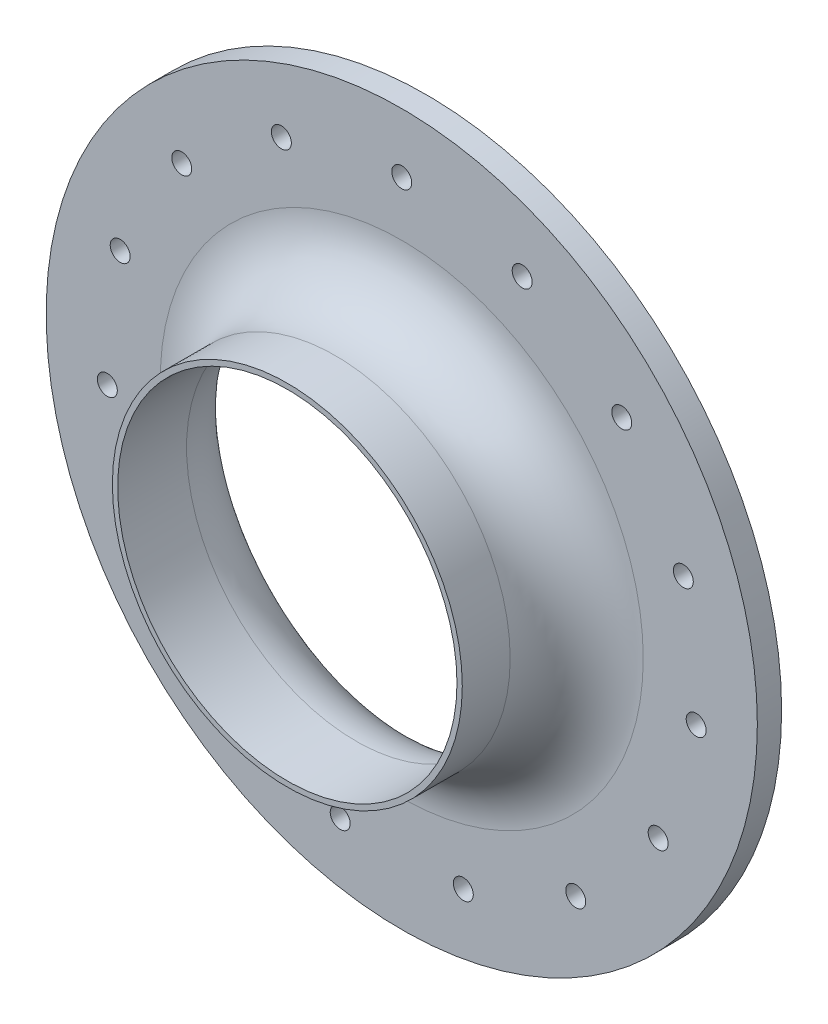
ISO-10303-21;
HEADER;
FILE_DESCRIPTION(('STEP AP214'),'2;1');
FILE_NAME('part.step','',(''),(''),'','','');
FILE_SCHEMA(('AUTOMOTIVE_DESIGN { 1 0 10303 214 1 1 1 1 }'));
ENDSEC;
DATA;
#1=APPLICATION_CONTEXT('core data for automotive mechanical design processes');
#2=APPLICATION_PROTOCOL_DEFINITION('international standard','automotive_design',2000,#1);
#3=PRODUCT_CONTEXT('',#1,'mechanical');
#4=PRODUCT('Part','Part','',(#3));
#5=PRODUCT_RELATED_PRODUCT_CATEGORY('part','',(#4));
#6=PRODUCT_DEFINITION_FORMATION('','',#4);
#7=PRODUCT_DEFINITION_CONTEXT('part definition',#1,'design');
#8=PRODUCT_DEFINITION('design','',#6,#7);
#9=PRODUCT_DEFINITION_SHAPE('','',#8);
#10=(LENGTH_UNIT() NAMED_UNIT(*) SI_UNIT(.MILLI.,.METRE.));
#11=(NAMED_UNIT(*) PLANE_ANGLE_UNIT() SI_UNIT($,.RADIAN.));
#12=(NAMED_UNIT(*) SI_UNIT($,.STERADIAN.) SOLID_ANGLE_UNIT());
#13=UNCERTAINTY_MEASURE_WITH_UNIT(LENGTH_MEASURE(1.E-05),#10,'distance_accuracy_value','');
#14=(GEOMETRIC_REPRESENTATION_CONTEXT(3) GLOBAL_UNCERTAINTY_ASSIGNED_CONTEXT((#13)) GLOBAL_UNIT_ASSIGNED_CONTEXT((#10,
#11,#12)) REPRESENTATION_CONTEXT('',''));
#15=CARTESIAN_POINT('',(0.,0.,0.));
#16=DIRECTION('',(0.,0.,1.));
#17=DIRECTION('',(1.,0.,0.));
#18=AXIS2_PLACEMENT_3D('',#15,#16,#17);
#19=CARTESIAN_POINT('',(0.,0.,0.));
#20=DIRECTION('',(0.,0.,1.));
#21=DIRECTION('',(1.,0.,0.));
#22=AXIS2_PLACEMENT_3D('',#19,#20,#21);
#23=CYLINDRICAL_SURFACE('',#22,53.45);
#24=CARTESIAN_POINT('',(0.,0.,-17.2));
#25=DIRECTION('',(0.,0.,1.));
#26=DIRECTION('',(1.,0.,0.));
#27=AXIS2_PLACEMENT_3D('',#24,#25,#26);
#28=CIRCLE('',#27,53.45);
#29=CARTESIAN_POINT('',(53.45,0.,-17.2));
#30=VERTEX_POINT('',#29);
#31=EDGE_CURVE('E10',#30,#30,#28,.T.);
#32=ORIENTED_EDGE('',*,*,#31,.F.);
#33=EDGE_LOOP('',(#32));
#34=FACE_BOUND('',#33,.T.);
#35=CARTESIAN_POINT('',(0.,0.,-20.85));
#36=DIRECTION('',(0.,0.,1.));
#37=DIRECTION('',(1.,0.,0.));
#38=AXIS2_PLACEMENT_3D('',#35,#36,#37);
#39=CIRCLE('',#38,53.45);
#40=CARTESIAN_POINT('',(53.45,0.,-20.85));
#41=VERTEX_POINT('',#40);
#42=EDGE_CURVE('E67',#41,#41,#39,.T.);
#43=ORIENTED_EDGE('',*,*,#42,.T.);
#44=EDGE_LOOP('',(#43));
#45=FACE_BOUND('',#44,.T.);
#46=ADVANCED_FACE('F39',(#34,#45),#23,.T.);
#47=CARTESIAN_POINT('',(0.,36.3,-17.2));
#48=DIRECTION('',(0.,0.,-1.));
#49=DIRECTION('',(-1.,0.,0.));
#50=AXIS2_PLACEMENT_3D('',#47,#48,#49);
#51=PLANE('',#50);
#52=CARTESIAN_POINT('',(18.0997806168731,40.6527728650957,-17.2));
#53=DIRECTION('',(0.,0.,1.));
#54=DIRECTION('',(1.,0.,0.));
#55=AXIS2_PLACEMENT_3D('',#52,#53,#54);
#56=CIRCLE('',#55,1.5);
#57=CARTESIAN_POINT('',(19.5997806168731,40.6527728650957,-17.2));
#58=VERTEX_POINT('',#57);
#59=EDGE_CURVE('E155',#58,#58,#56,.T.);
#60=ORIENTED_EDGE('',*,*,#59,.F.);
#61=EDGE_LOOP('',(#60));
#62=FACE_BOUND('',#61,.T.);
#63=CARTESIAN_POINT('',(33.0699447337441,29.7763119829692,-17.2));
#64=DIRECTION('',(0.,0.,1.));
#65=DIRECTION('',(1.,0.,0.));
#66=AXIS2_PLACEMENT_3D('',#63,#64,#65);
#67=CIRCLE('',#66,1.5);
#68=CARTESIAN_POINT('',(34.5699447337441,29.7763119829692,-17.2));
#69=VERTEX_POINT('',#68);
#70=EDGE_CURVE('E149',#69,#69,#67,.T.);
#71=ORIENTED_EDGE('',*,*,#70,.F.);
#72=EDGE_LOOP('',(#71));
#73=FACE_BOUND('',#72,.T.);
#74=CARTESIAN_POINT('',(42.3220149751343,13.7512562496852,-17.2));
#75=DIRECTION('',(0.,0.,1.));
#76=DIRECTION('',(1.,0.,0.));
#77=AXIS2_PLACEMENT_3D('',#74,#75,#76);
#78=CIRCLE('',#77,1.5);
#79=CARTESIAN_POINT('',(43.8220149751343,13.7512562496852,-17.2));
#80=VERTEX_POINT('',#79);
#81=EDGE_CURVE('E143',#80,#80,#78,.T.);
#82=ORIENTED_EDGE('',*,*,#81,.F.);
#83=EDGE_LOOP('',(#82));
#84=FACE_BOUND('',#83,.T.);
#85=CARTESIAN_POINT('',(44.2562243438882,-4.65151661541058,-17.2));
#86=DIRECTION('',(0.,0.,1.));
#87=DIRECTION('',(1.,0.,0.));
#88=AXIS2_PLACEMENT_3D('',#85,#86,#87);
#89=CIRCLE('',#88,1.50000000000063);
#90=CARTESIAN_POINT('',(45.7562243438888,-4.65151661541058,-17.2));
#91=VERTEX_POINT('',#90);
#92=EDGE_CURVE('E137',#91,#91,#89,.T.);
#93=ORIENTED_EDGE('',*,*,#92,.F.);
#94=EDGE_LOOP('',(#93));
#95=FACE_BOUND('',#94,.T.);
#96=CARTESIAN_POINT('',(38.5381304684075,-22.25,-17.2));
#97=DIRECTION('',(0.,0.,1.));
#98=DIRECTION('',(1.,0.,0.));
#99=AXIS2_PLACEMENT_3D('',#96,#97,#98);
#100=CIRCLE('',#99,1.5000000000002);
#101=CARTESIAN_POINT('',(40.0381304684077,-22.25,-17.2));
#102=VERTEX_POINT('',#101);
#103=EDGE_CURVE('E131',#102,#102,#100,.T.);
#104=ORIENTED_EDGE('',*,*,#103,.F.);
#105=EDGE_LOOP('',(#104));
#106=FACE_BOUND('',#105,.T.);
#107=CARTESIAN_POINT('',(26.1564437270151,-36.0012562496852,-17.2));
#108=DIRECTION('',(0.,0.,1.));
#109=DIRECTION('',(1.,0.,0.));
#110=AXIS2_PLACEMENT_3D('',#107,#108,#109);
#111=CIRCLE('',#110,1.50000000000021);
#112=CARTESIAN_POINT('',(27.6564437270153,-36.0012562496852,-17.2));
#113=VERTEX_POINT('',#112);
#114=EDGE_CURVE('E125',#113,#113,#111,.T.);
#115=ORIENTED_EDGE('',*,*,#114,.F.);
#116=EDGE_LOOP('',(#115));
#117=FACE_BOUND('',#116,.T.);
#118=CARTESIAN_POINT('',(9.2520702413903,-43.5275682326544,-17.2));
#119=DIRECTION('',(0.,0.,1.));
#120=DIRECTION('',(1.,0.,0.));
#121=AXIS2_PLACEMENT_3D('',#118,#119,#120);
#122=CIRCLE('',#121,1.50000000000026);
#123=CARTESIAN_POINT('',(10.7520702413906,-43.5275682326544,-17.2));
#124=VERTEX_POINT('',#123);
#125=EDGE_CURVE('E119',#124,#124,#122,.T.);
#126=ORIENTED_EDGE('',*,*,#125,.F.);
#127=EDGE_LOOP('',(#126));
#128=FACE_BOUND('',#127,.T.);
#129=CARTESIAN_POINT('',(-9.25207024139029,-43.5275682326544,-17.2));
#130=DIRECTION('',(0.,0.,1.));
#131=DIRECTION('',(1.,0.,0.));
#132=AXIS2_PLACEMENT_3D('',#129,#130,#131);
#133=CIRCLE('',#132,1.50000000000031);
#134=CARTESIAN_POINT('',(-7.75207024138998,-43.5275682326544,-17.2));
#135=VERTEX_POINT('',#134);
#136=EDGE_CURVE('E113',#135,#135,#133,.T.);
#137=ORIENTED_EDGE('',*,*,#136,.F.);
#138=EDGE_LOOP('',(#137));
#139=FACE_BOUND('',#138,.T.);
#140=CARTESIAN_POINT('',(-26.1564437270151,-36.0012562496852,-17.2));
#141=DIRECTION('',(0.,0.,1.));
#142=DIRECTION('',(1.,0.,0.));
#143=AXIS2_PLACEMENT_3D('',#140,#141,#142);
#144=CIRCLE('',#143,1.50000000000034);
#145=CARTESIAN_POINT('',(-24.6564437270147,-36.0012562496852,-17.2));
#146=VERTEX_POINT('',#145);
#147=EDGE_CURVE('E107',#146,#146,#144,.T.);
#148=ORIENTED_EDGE('',*,*,#147,.F.);
#149=EDGE_LOOP('',(#148));
#150=FACE_BOUND('',#149,.T.);
#151=CARTESIAN_POINT('',(-38.5381304684076,-22.25,-17.2));
#152=DIRECTION('',(0.,0.,1.));
#153=DIRECTION('',(1.,0.,0.));
#154=AXIS2_PLACEMENT_3D('',#151,#152,#153);
#155=CIRCLE('',#154,1.50000000000039);
#156=CARTESIAN_POINT('',(-37.0381304684072,-22.25,-17.2));
#157=VERTEX_POINT('',#156);
#158=EDGE_CURVE('E101',#157,#157,#155,.T.);
#159=ORIENTED_EDGE('',*,*,#158,.F.);
#160=EDGE_LOOP('',(#159));
#161=FACE_BOUND('',#160,.T.);
#162=CARTESIAN_POINT('',(-44.2562243438882,-4.65151661541059,-17.2));
#163=DIRECTION('',(0.,0.,1.));
#164=DIRECTION('',(1.,0.,0.));
#165=AXIS2_PLACEMENT_3D('',#162,#163,#164);
#166=CIRCLE('',#165,1.50000000000126);
#167=CARTESIAN_POINT('',(-42.7562243438869,-4.65151661541059,-17.2));
#168=VERTEX_POINT('',#167);
#169=EDGE_CURVE('E95',#168,#168,#166,.T.);
#170=ORIENTED_EDGE('',*,*,#169,.F.);
#171=EDGE_LOOP('',(#170));
#172=FACE_BOUND('',#171,.T.);
#173=CARTESIAN_POINT('',(-42.3220149751344,13.7512562496852,-17.2));
#174=DIRECTION('',(0.,0.,1.));
#175=DIRECTION('',(1.,0.,0.));
#176=AXIS2_PLACEMENT_3D('',#173,#174,#175);
#177=CIRCLE('',#176,1.50000000000103);
#178=CARTESIAN_POINT('',(-40.8220149751333,13.7512562496852,-17.2));
#179=VERTEX_POINT('',#178);
#180=EDGE_CURVE('E89',#179,#179,#177,.T.);
#181=ORIENTED_EDGE('',*,*,#180,.F.);
#182=EDGE_LOOP('',(#181));
#183=FACE_BOUND('',#182,.T.);
#184=CARTESIAN_POINT('',(-33.0699447337441,29.7763119829692,-17.2));
#185=DIRECTION('',(0.,0.,1.));
#186=DIRECTION('',(1.,0.,0.));
#187=AXIS2_PLACEMENT_3D('',#184,#185,#186);
#188=CIRCLE('',#187,1.5);
#189=CARTESIAN_POINT('',(-31.5699447337441,29.7763119829692,-17.2));
#190=VERTEX_POINT('',#189);
#191=EDGE_CURVE('E83',#190,#190,#188,.T.);
#192=ORIENTED_EDGE('',*,*,#191,.F.);
#193=EDGE_LOOP('',(#192));
#194=FACE_BOUND('',#193,.T.);
#195=CARTESIAN_POINT('',(-18.0997806168731,40.6527728650957,-17.2));
#196=DIRECTION('',(0.,0.,1.));
#197=DIRECTION('',(1.,0.,0.));
#198=AXIS2_PLACEMENT_3D('',#195,#196,#197);
#199=CIRCLE('',#198,1.5);
#200=CARTESIAN_POINT('',(-16.5997806168731,40.6527728650957,-17.2));
#201=VERTEX_POINT('',#200);
#202=EDGE_CURVE('E77',#201,#201,#199,.T.);
#203=ORIENTED_EDGE('',*,*,#202,.F.);
#204=EDGE_LOOP('',(#203));
#205=FACE_BOUND('',#204,.T.);
#206=CARTESIAN_POINT('',(0.,44.5,-17.2));
#207=DIRECTION('',(0.,0.,1.));
#208=DIRECTION('',(1.,0.,0.));
#209=AXIS2_PLACEMENT_3D('',#206,#207,#208);
#210=CIRCLE('',#209,1.5);
#211=CARTESIAN_POINT('',(1.5,44.5,-17.2));
#212=VERTEX_POINT('',#211);
#213=EDGE_CURVE('E71',#212,#212,#210,.T.);
#214=ORIENTED_EDGE('',*,*,#213,.F.);
#215=EDGE_LOOP('',(#214));
#216=FACE_BOUND('',#215,.T.);
#217=CARTESIAN_POINT('',(0.,0.,-17.2));
#218=DIRECTION('',(0.,0.,1.));
#219=DIRECTION('',(1.,0.,0.));
#220=AXIS2_PLACEMENT_3D('',#217,#218,#219);
#221=CIRCLE('',#220,36.3);
#222=CARTESIAN_POINT('',(36.3,0.,-17.2));
#223=VERTEX_POINT('',#222);
#224=EDGE_CURVE('E45',#223,#223,#221,.T.);
#225=ORIENTED_EDGE('',*,*,#224,.F.);
#226=EDGE_LOOP('',(#225));
#227=FACE_BOUND('',#226,.T.);
#228=ORIENTED_EDGE('',*,*,#31,.T.);
#229=EDGE_LOOP('',(#228));
#230=FACE_BOUND('',#229,.T.);
#231=ADVANCED_FACE('F171',(#62,#73,#84,#95,#106,#117,#128,#139,#150,#161,#172,#183,#194,#205,
#216,#227,#230),#51,.F.);
#232=CARTESIAN_POINT('',(0.,0.,-7.2));
#233=DIRECTION('',(0.,0.,1.));
#234=DIRECTION('',(1.,0.,0.));
#235=AXIS2_PLACEMENT_3D('',#232,#233,#234);
#236=TOROIDAL_SURFACE('',#235,36.3,9.99999999999999);
#237=CARTESIAN_POINT('',(0.,0.,-7.2));
#238=DIRECTION('',(0.,0.,1.));
#239=DIRECTION('',(1.,0.,0.));
#240=AXIS2_PLACEMENT_3D('',#237,#238,#239);
#241=CIRCLE('',#240,26.3);
#242=CARTESIAN_POINT('',(26.3,0.,-7.2));
#243=VERTEX_POINT('',#242);
#244=EDGE_CURVE('E49',#243,#243,#241,.T.);
#245=ORIENTED_EDGE('',*,*,#244,.F.);
#246=EDGE_LOOP('',(#245));
#247=FACE_BOUND('',#246,.T.);
#248=ORIENTED_EDGE('',*,*,#224,.T.);
#249=EDGE_LOOP('',(#248));
#250=FACE_BOUND('',#249,.T.);
#251=ADVANCED_FACE('F174',(#247,#250),#236,.F.);
#252=CARTESIAN_POINT('',(0.,0.,0.));
#253=DIRECTION('',(0.,0.,1.));
#254=DIRECTION('',(1.,0.,0.));
#255=AXIS2_PLACEMENT_3D('',#252,#253,#254);
#256=CYLINDRICAL_SURFACE('',#255,26.3);
#257=CARTESIAN_POINT('',(0.,0.,0.));
#258=DIRECTION('',(0.,0.,1.));
#259=DIRECTION('',(1.,0.,0.));
#260=AXIS2_PLACEMENT_3D('',#257,#258,#259);
#261=CIRCLE('',#260,26.3);
#262=CARTESIAN_POINT('',(26.3,0.,0.));
#263=VERTEX_POINT('',#262);
#264=EDGE_CURVE('E53',#263,#263,#261,.T.);
#265=ORIENTED_EDGE('',*,*,#264,.F.);
#266=EDGE_LOOP('',(#265));
#267=FACE_BOUND('',#266,.T.);
#268=ORIENTED_EDGE('',*,*,#244,.T.);
#269=EDGE_LOOP('',(#268));
#270=FACE_BOUND('',#269,.T.);
#271=ADVANCED_FACE('F243',(#267,#270),#256,.T.);
#272=CARTESIAN_POINT('',(0.,25.5,0.));
#273=DIRECTION('',(0.,0.,-1.));
#274=DIRECTION('',(-1.,0.,0.));
#275=AXIS2_PLACEMENT_3D('',#272,#273,#274);
#276=PLANE('',#275);
#277=CARTESIAN_POINT('',(0.,0.,0.));
#278=DIRECTION('',(0.,0.,1.));
#279=DIRECTION('',(1.,0.,0.));
#280=AXIS2_PLACEMENT_3D('',#277,#278,#279);
#281=CIRCLE('',#280,25.5);
#282=CARTESIAN_POINT('',(25.5,0.,0.));
#283=VERTEX_POINT('',#282);
#284=EDGE_CURVE('E58',#283,#283,#281,.T.);
#285=ORIENTED_EDGE('',*,*,#284,.F.);
#286=EDGE_LOOP('',(#285));
#287=FACE_BOUND('',#286,.T.);
#288=ORIENTED_EDGE('',*,*,#264,.T.);
#289=EDGE_LOOP('',(#288));
#290=FACE_BOUND('',#289,.T.);
#291=ADVANCED_FACE('F237',(#287,#290),#276,.F.);
#292=CARTESIAN_POINT('',(0.,0.,0.));
#293=DIRECTION('',(0.,0.,1.));
#294=DIRECTION('',(1.,0.,0.));
#295=AXIS2_PLACEMENT_3D('',#292,#293,#294);
#296=CYLINDRICAL_SURFACE('',#295,25.5);
#297=CARTESIAN_POINT('',(0.,0.,-10.35));
#298=DIRECTION('',(0.,0.,1.));
#299=DIRECTION('',(1.,0.,0.));
#300=AXIS2_PLACEMENT_3D('',#297,#298,#299);
#301=CIRCLE('',#300,25.5);
#302=CARTESIAN_POINT('',(25.5,0.,-10.35));
#303=VERTEX_POINT('',#302);
#304=EDGE_CURVE('E61',#303,#303,#301,.T.);
#305=ORIENTED_EDGE('',*,*,#304,.F.);
#306=EDGE_LOOP('',(#305));
#307=FACE_BOUND('',#306,.T.);
#308=ORIENTED_EDGE('',*,*,#284,.T.);
#309=EDGE_LOOP('',(#308));
#310=FACE_BOUND('',#309,.T.);
#311=ADVANCED_FACE('F231',(#307,#310),#296,.F.);
#312=CARTESIAN_POINT('',(0.,0.,-10.35));
#313=DIRECTION('',(0.,0.,1.));
#314=DIRECTION('',(1.,0.,0.));
#315=AXIS2_PLACEMENT_3D('',#312,#313,#314);
#316=TOROIDAL_SURFACE('',#315,36.,10.5);
#317=CARTESIAN_POINT('',(0.,0.,-20.85));
#318=DIRECTION('',(0.,0.,1.));
#319=DIRECTION('',(1.,0.,0.));
#320=AXIS2_PLACEMENT_3D('',#317,#318,#319);
#321=CIRCLE('',#320,36.);
#322=CARTESIAN_POINT('',(36.,0.,-20.85));
#323=VERTEX_POINT('',#322);
#324=EDGE_CURVE('E64',#323,#323,#321,.T.);
#325=ORIENTED_EDGE('',*,*,#324,.F.);
#326=EDGE_LOOP('',(#325));
#327=FACE_BOUND('',#326,.T.);
#328=ORIENTED_EDGE('',*,*,#304,.T.);
#329=EDGE_LOOP('',(#328));
#330=FACE_BOUND('',#329,.T.);
#331=ADVANCED_FACE('F216',(#327,#330),#316,.T.);
#332=CARTESIAN_POINT('',(0.,46.5,-20.85));
#333=DIRECTION('',(0.,0.,1.));
#334=DIRECTION('',(1.,0.,0.));
#335=AXIS2_PLACEMENT_3D('',#332,#333,#334);
#336=PLANE('',#335);
#337=CARTESIAN_POINT('',(18.0997806168731,40.6527728650957,-20.85));
#338=DIRECTION('',(0.,0.,1.));
#339=DIRECTION('',(1.,0.,0.));
#340=AXIS2_PLACEMENT_3D('',#337,#338,#339);
#341=CIRCLE('',#340,1.5);
#342=CARTESIAN_POINT('',(19.5997806168731,40.6527728650957,-20.85));
#343=VERTEX_POINT('',#342);
#344=EDGE_CURVE('E74',#343,#343,#341,.T.);
#345=ORIENTED_EDGE('',*,*,#344,.T.);
#346=EDGE_LOOP('',(#345));
#347=FACE_BOUND('',#346,.T.);
#348=CARTESIAN_POINT('',(33.0699447337441,29.7763119829692,-20.85));
#349=DIRECTION('',(0.,0.,1.));
#350=DIRECTION('',(1.,0.,0.));
#351=AXIS2_PLACEMENT_3D('',#348,#349,#350);
#352=CIRCLE('',#351,1.5);
#353=CARTESIAN_POINT('',(34.5699447337441,29.7763119829692,-20.85));
#354=VERTEX_POINT('',#353);
#355=EDGE_CURVE('E152',#354,#354,#352,.T.);
#356=ORIENTED_EDGE('',*,*,#355,.T.);
#357=EDGE_LOOP('',(#356));
#358=FACE_BOUND('',#357,.T.);
#359=CARTESIAN_POINT('',(42.3220149751343,13.7512562496852,-20.85));
#360=DIRECTION('',(0.,0.,1.));
#361=DIRECTION('',(1.,0.,0.));
#362=AXIS2_PLACEMENT_3D('',#359,#360,#361);
#363=CIRCLE('',#362,1.5);
#364=CARTESIAN_POINT('',(43.8220149751343,13.7512562496852,-20.85));
#365=VERTEX_POINT('',#364);
#366=EDGE_CURVE('E146',#365,#365,#363,.T.);
#367=ORIENTED_EDGE('',*,*,#366,.T.);
#368=EDGE_LOOP('',(#367));
#369=FACE_BOUND('',#368,.T.);
#370=CARTESIAN_POINT('',(44.2562243438882,-4.65151661541058,-20.85));
#371=DIRECTION('',(0.,0.,1.));
#372=DIRECTION('',(1.,0.,0.));
#373=AXIS2_PLACEMENT_3D('',#370,#371,#372);
#374=CIRCLE('',#373,1.50000000000063);
#375=CARTESIAN_POINT('',(45.7562243438888,-4.65151661541058,-20.85));
#376=VERTEX_POINT('',#375);
#377=EDGE_CURVE('E140',#376,#376,#374,.T.);
#378=ORIENTED_EDGE('',*,*,#377,.T.);
#379=EDGE_LOOP('',(#378));
#380=FACE_BOUND('',#379,.T.);
#381=CARTESIAN_POINT('',(38.5381304684075,-22.25,-20.85));
#382=DIRECTION('',(0.,0.,1.));
#383=DIRECTION('',(1.,0.,0.));
#384=AXIS2_PLACEMENT_3D('',#381,#382,#383);
#385=CIRCLE('',#384,1.5000000000002);
#386=CARTESIAN_POINT('',(40.0381304684077,-22.25,-20.85));
#387=VERTEX_POINT('',#386);
#388=EDGE_CURVE('E134',#387,#387,#385,.T.);
#389=ORIENTED_EDGE('',*,*,#388,.T.);
#390=EDGE_LOOP('',(#389));
#391=FACE_BOUND('',#390,.T.);
#392=CARTESIAN_POINT('',(26.1564437270151,-36.0012562496852,-20.85));
#393=DIRECTION('',(0.,0.,1.));
#394=DIRECTION('',(1.,0.,0.));
#395=AXIS2_PLACEMENT_3D('',#392,#393,#394);
#396=CIRCLE('',#395,1.50000000000021);
#397=CARTESIAN_POINT('',(27.6564437270153,-36.0012562496852,-20.85));
#398=VERTEX_POINT('',#397);
#399=EDGE_CURVE('E128',#398,#398,#396,.T.);
#400=ORIENTED_EDGE('',*,*,#399,.T.);
#401=EDGE_LOOP('',(#400));
#402=FACE_BOUND('',#401,.T.);
#403=CARTESIAN_POINT('',(9.2520702413903,-43.5275682326544,-20.85));
#404=DIRECTION('',(0.,0.,1.));
#405=DIRECTION('',(1.,0.,0.));
#406=AXIS2_PLACEMENT_3D('',#403,#404,#405);
#407=CIRCLE('',#406,1.50000000000026);
#408=CARTESIAN_POINT('',(10.7520702413906,-43.5275682326544,-20.85));
#409=VERTEX_POINT('',#408);
#410=EDGE_CURVE('E122',#409,#409,#407,.T.);
#411=ORIENTED_EDGE('',*,*,#410,.T.);
#412=EDGE_LOOP('',(#411));
#413=FACE_BOUND('',#412,.T.);
#414=CARTESIAN_POINT('',(-9.25207024139029,-43.5275682326544,-20.85));
#415=DIRECTION('',(0.,0.,1.));
#416=DIRECTION('',(1.,0.,0.));
#417=AXIS2_PLACEMENT_3D('',#414,#415,#416);
#418=CIRCLE('',#417,1.50000000000031);
#419=CARTESIAN_POINT('',(-7.75207024138998,-43.5275682326544,-20.85));
#420=VERTEX_POINT('',#419);
#421=EDGE_CURVE('E116',#420,#420,#418,.T.);
#422=ORIENTED_EDGE('',*,*,#421,.T.);
#423=EDGE_LOOP('',(#422));
#424=FACE_BOUND('',#423,.T.);
#425=CARTESIAN_POINT('',(-26.1564437270151,-36.0012562496852,-20.85));
#426=DIRECTION('',(0.,0.,1.));
#427=DIRECTION('',(1.,0.,0.));
#428=AXIS2_PLACEMENT_3D('',#425,#426,#427);
#429=CIRCLE('',#428,1.50000000000034);
#430=CARTESIAN_POINT('',(-24.6564437270147,-36.0012562496852,-20.85));
#431=VERTEX_POINT('',#430);
#432=EDGE_CURVE('E110',#431,#431,#429,.T.);
#433=ORIENTED_EDGE('',*,*,#432,.T.);
#434=EDGE_LOOP('',(#433));
#435=FACE_BOUND('',#434,.T.);
#436=CARTESIAN_POINT('',(-38.5381304684076,-22.25,-20.85));
#437=DIRECTION('',(0.,0.,1.));
#438=DIRECTION('',(1.,0.,0.));
#439=AXIS2_PLACEMENT_3D('',#436,#437,#438);
#440=CIRCLE('',#439,1.50000000000039);
#441=CARTESIAN_POINT('',(-37.0381304684072,-22.25,-20.85));
#442=VERTEX_POINT('',#441);
#443=EDGE_CURVE('E104',#442,#442,#440,.T.);
#444=ORIENTED_EDGE('',*,*,#443,.T.);
#445=EDGE_LOOP('',(#444));
#446=FACE_BOUND('',#445,.T.);
#447=CARTESIAN_POINT('',(-44.2562243438882,-4.65151661541059,-20.85));
#448=DIRECTION('',(0.,0.,1.));
#449=DIRECTION('',(1.,0.,0.));
#450=AXIS2_PLACEMENT_3D('',#447,#448,#449);
#451=CIRCLE('',#450,1.50000000000126);
#452=CARTESIAN_POINT('',(-42.7562243438869,-4.65151661541059,-20.85));
#453=VERTEX_POINT('',#452);
#454=EDGE_CURVE('E98',#453,#453,#451,.T.);
#455=ORIENTED_EDGE('',*,*,#454,.T.);
#456=EDGE_LOOP('',(#455));
#457=FACE_BOUND('',#456,.T.);
#458=CARTESIAN_POINT('',(-42.3220149751344,13.7512562496852,-20.85));
#459=DIRECTION('',(0.,0.,1.));
#460=DIRECTION('',(1.,0.,0.));
#461=AXIS2_PLACEMENT_3D('',#458,#459,#460);
#462=CIRCLE('',#461,1.50000000000103);
#463=CARTESIAN_POINT('',(-40.8220149751333,13.7512562496852,-20.85));
#464=VERTEX_POINT('',#463);
#465=EDGE_CURVE('E92',#464,#464,#462,.T.);
#466=ORIENTED_EDGE('',*,*,#465,.T.);
#467=EDGE_LOOP('',(#466));
#468=FACE_BOUND('',#467,.T.);
#469=CARTESIAN_POINT('',(-33.0699447337441,29.7763119829692,-20.85));
#470=DIRECTION('',(0.,0.,1.));
#471=DIRECTION('',(1.,0.,0.));
#472=AXIS2_PLACEMENT_3D('',#469,#470,#471);
#473=CIRCLE('',#472,1.5);
#474=CARTESIAN_POINT('',(-31.5699447337441,29.7763119829692,-20.85));
#475=VERTEX_POINT('',#474);
#476=EDGE_CURVE('E86',#475,#475,#473,.T.);
#477=ORIENTED_EDGE('',*,*,#476,.T.);
#478=EDGE_LOOP('',(#477));
#479=FACE_BOUND('',#478,.T.);
#480=CARTESIAN_POINT('',(-18.0997806168731,40.6527728650957,-20.85));
#481=DIRECTION('',(0.,0.,1.));
#482=DIRECTION('',(1.,0.,0.));
#483=AXIS2_PLACEMENT_3D('',#480,#481,#482);
#484=CIRCLE('',#483,1.5);
#485=CARTESIAN_POINT('',(-16.5997806168731,40.6527728650957,-20.85));
#486=VERTEX_POINT('',#485);
#487=EDGE_CURVE('E80',#486,#486,#484,.T.);
#488=ORIENTED_EDGE('',*,*,#487,.T.);
#489=EDGE_LOOP('',(#488));
#490=FACE_BOUND('',#489,.T.);
#491=CARTESIAN_POINT('',(0.,44.5,-20.85));
#492=DIRECTION('',(0.,0.,1.));
#493=DIRECTION('',(1.,0.,0.));
#494=AXIS2_PLACEMENT_3D('',#491,#492,#493);
#495=CIRCLE('',#494,1.5);
#496=CARTESIAN_POINT('',(1.5,44.5,-20.85));
#497=VERTEX_POINT('',#496);
#498=EDGE_CURVE('E70',#497,#497,#495,.T.);
#499=ORIENTED_EDGE('',*,*,#498,.T.);
#500=EDGE_LOOP('',(#499));
#501=FACE_BOUND('',#500,.T.);
#502=ORIENTED_EDGE('',*,*,#42,.F.);
#503=EDGE_LOOP('',(#502));
#504=FACE_BOUND('',#503,.T.);
#505=ORIENTED_EDGE('',*,*,#324,.T.);
#506=EDGE_LOOP('',(#505));
#507=FACE_BOUND('',#506,.T.);
#508=ADVANCED_FACE('F161',(#347,#358,#369,#380,#391,#402,#413,#424,#435,#446,#457,#468,#479,
#490,#501,#504,#507),#336,.F.);
#509=CARTESIAN_POINT('',(0.,44.5,-20.85));
#510=DIRECTION('',(0.,0.,1.));
#511=DIRECTION('',(1.,0.,0.));
#512=AXIS2_PLACEMENT_3D('',#509,#510,#511);
#513=CYLINDRICAL_SURFACE('',#512,1.5);
#514=ORIENTED_EDGE('',*,*,#498,.F.);
#515=EDGE_LOOP('',(#514));
#516=FACE_BOUND('',#515,.T.);
#517=ORIENTED_EDGE('',*,*,#213,.T.);
#518=EDGE_LOOP('',(#517));
#519=FACE_BOUND('',#518,.T.);
#520=ADVANCED_FACE('F204',(#516,#519),#513,.F.);
#521=CARTESIAN_POINT('',(-18.0997806168731,40.6527728650957,-20.85));
#522=DIRECTION('',(0.,0.,1.));
#523=DIRECTION('',(1.,0.,0.));
#524=AXIS2_PLACEMENT_3D('',#521,#522,#523);
#525=CYLINDRICAL_SURFACE('',#524,1.5);
#526=ORIENTED_EDGE('',*,*,#487,.F.);
#527=EDGE_LOOP('',(#526));
#528=FACE_BOUND('',#527,.T.);
#529=ORIENTED_EDGE('',*,*,#202,.T.);
#530=EDGE_LOOP('',(#529));
#531=FACE_BOUND('',#530,.T.);
#532=ADVANCED_FACE('F206',(#528,#531),#525,.F.);
#533=CARTESIAN_POINT('',(-33.0699447337441,29.7763119829692,-20.85));
#534=DIRECTION('',(0.,0.,1.));
#535=DIRECTION('',(1.,0.,0.));
#536=AXIS2_PLACEMENT_3D('',#533,#534,#535);
#537=CYLINDRICAL_SURFACE('',#536,1.5);
#538=ORIENTED_EDGE('',*,*,#476,.F.);
#539=EDGE_LOOP('',(#538));
#540=FACE_BOUND('',#539,.T.);
#541=ORIENTED_EDGE('',*,*,#191,.T.);
#542=EDGE_LOOP('',(#541));
#543=FACE_BOUND('',#542,.T.);
#544=ADVANCED_FACE('F213',(#540,#543),#537,.F.);
#545=CARTESIAN_POINT('',(-42.3220149751344,13.7512562496852,-20.85));
#546=DIRECTION('',(0.,0.,1.));
#547=DIRECTION('',(1.,0.,0.));
#548=AXIS2_PLACEMENT_3D('',#545,#546,#547);
#549=CYLINDRICAL_SURFACE('',#548,1.50000000000103);
#550=ORIENTED_EDGE('',*,*,#465,.F.);
#551=EDGE_LOOP('',(#550));
#552=FACE_BOUND('',#551,.T.);
#553=ORIENTED_EDGE('',*,*,#180,.T.);
#554=EDGE_LOOP('',(#553));
#555=FACE_BOUND('',#554,.T.);
#556=ADVANCED_FACE('F302',(#552,#555),#549,.F.);
#557=CARTESIAN_POINT('',(-44.2562243438882,-4.65151661541059,-20.85));
#558=DIRECTION('',(0.,0.,1.));
#559=DIRECTION('',(1.,0.,0.));
#560=AXIS2_PLACEMENT_3D('',#557,#558,#559);
#561=CYLINDRICAL_SURFACE('',#560,1.50000000000126);
#562=ORIENTED_EDGE('',*,*,#454,.F.);
#563=EDGE_LOOP('',(#562));
#564=FACE_BOUND('',#563,.T.);
#565=ORIENTED_EDGE('',*,*,#169,.T.);
#566=EDGE_LOOP('',(#565));
#567=FACE_BOUND('',#566,.T.);
#568=ADVANCED_FACE('F313',(#564,#567),#561,.F.);
#569=CARTESIAN_POINT('',(-38.5381304684076,-22.25,-20.85));
#570=DIRECTION('',(0.,0.,1.));
#571=DIRECTION('',(1.,0.,0.));
#572=AXIS2_PLACEMENT_3D('',#569,#570,#571);
#573=CYLINDRICAL_SURFACE('',#572,1.50000000000039);
#574=ORIENTED_EDGE('',*,*,#443,.F.);
#575=EDGE_LOOP('',(#574));
#576=FACE_BOUND('',#575,.T.);
#577=ORIENTED_EDGE('',*,*,#158,.T.);
#578=EDGE_LOOP('',(#577));
#579=FACE_BOUND('',#578,.T.);
#580=ADVANCED_FACE('F324',(#576,#579),#573,.F.);
#581=CARTESIAN_POINT('',(-26.1564437270151,-36.0012562496852,-20.85));
#582=DIRECTION('',(0.,0.,1.));
#583=DIRECTION('',(1.,0.,0.));
#584=AXIS2_PLACEMENT_3D('',#581,#582,#583);
#585=CYLINDRICAL_SURFACE('',#584,1.50000000000034);
#586=ORIENTED_EDGE('',*,*,#432,.F.);
#587=EDGE_LOOP('',(#586));
#588=FACE_BOUND('',#587,.T.);
#589=ORIENTED_EDGE('',*,*,#147,.T.);
#590=EDGE_LOOP('',(#589));
#591=FACE_BOUND('',#590,.T.);
#592=ADVANCED_FACE('F335',(#588,#591),#585,.F.);
#593=CARTESIAN_POINT('',(-9.25207024139029,-43.5275682326544,-20.85));
#594=DIRECTION('',(0.,0.,1.));
#595=DIRECTION('',(1.,0.,0.));
#596=AXIS2_PLACEMENT_3D('',#593,#594,#595);
#597=CYLINDRICAL_SURFACE('',#596,1.50000000000031);
#598=ORIENTED_EDGE('',*,*,#421,.F.);
#599=EDGE_LOOP('',(#598));
#600=FACE_BOUND('',#599,.T.);
#601=ORIENTED_EDGE('',*,*,#136,.T.);
#602=EDGE_LOOP('',(#601));
#603=FACE_BOUND('',#602,.T.);
#604=ADVANCED_FACE('F346',(#600,#603),#597,.F.);
#605=CARTESIAN_POINT('',(9.2520702413903,-43.5275682326544,-20.85));
#606=DIRECTION('',(0.,0.,1.));
#607=DIRECTION('',(1.,0.,0.));
#608=AXIS2_PLACEMENT_3D('',#605,#606,#607);
#609=CYLINDRICAL_SURFACE('',#608,1.50000000000026);
#610=ORIENTED_EDGE('',*,*,#410,.F.);
#611=EDGE_LOOP('',(#610));
#612=FACE_BOUND('',#611,.T.);
#613=ORIENTED_EDGE('',*,*,#125,.T.);
#614=EDGE_LOOP('',(#613));
#615=FACE_BOUND('',#614,.T.);
#616=ADVANCED_FACE('F357',(#612,#615),#609,.F.);
#617=CARTESIAN_POINT('',(26.1564437270151,-36.0012562496852,-20.85));
#618=DIRECTION('',(0.,0.,1.));
#619=DIRECTION('',(1.,0.,0.));
#620=AXIS2_PLACEMENT_3D('',#617,#618,#619);
#621=CYLINDRICAL_SURFACE('',#620,1.50000000000021);
#622=ORIENTED_EDGE('',*,*,#399,.F.);
#623=EDGE_LOOP('',(#622));
#624=FACE_BOUND('',#623,.T.);
#625=ORIENTED_EDGE('',*,*,#114,.T.);
#626=EDGE_LOOP('',(#625));
#627=FACE_BOUND('',#626,.T.);
#628=ADVANCED_FACE('F368',(#624,#627),#621,.F.);
#629=CARTESIAN_POINT('',(38.5381304684075,-22.25,-20.85));
#630=DIRECTION('',(0.,0.,1.));
#631=DIRECTION('',(1.,0.,0.));
#632=AXIS2_PLACEMENT_3D('',#629,#630,#631);
#633=CYLINDRICAL_SURFACE('',#632,1.5000000000002);
#634=ORIENTED_EDGE('',*,*,#388,.F.);
#635=EDGE_LOOP('',(#634));
#636=FACE_BOUND('',#635,.T.);
#637=ORIENTED_EDGE('',*,*,#103,.T.);
#638=EDGE_LOOP('',(#637));
#639=FACE_BOUND('',#638,.T.);
#640=ADVANCED_FACE('F379',(#636,#639),#633,.F.);
#641=CARTESIAN_POINT('',(44.2562243438882,-4.65151661541058,-20.85));
#642=DIRECTION('',(0.,0.,1.));
#643=DIRECTION('',(1.,0.,0.));
#644=AXIS2_PLACEMENT_3D('',#641,#642,#643);
#645=CYLINDRICAL_SURFACE('',#644,1.50000000000063);
#646=ORIENTED_EDGE('',*,*,#377,.F.);
#647=EDGE_LOOP('',(#646));
#648=FACE_BOUND('',#647,.T.);
#649=ORIENTED_EDGE('',*,*,#92,.T.);
#650=EDGE_LOOP('',(#649));
#651=FACE_BOUND('',#650,.T.);
#652=ADVANCED_FACE('F390',(#648,#651),#645,.F.);
#653=CARTESIAN_POINT('',(42.3220149751343,13.7512562496852,-20.85));
#654=DIRECTION('',(0.,0.,1.));
#655=DIRECTION('',(1.,0.,0.));
#656=AXIS2_PLACEMENT_3D('',#653,#654,#655);
#657=CYLINDRICAL_SURFACE('',#656,1.5);
#658=ORIENTED_EDGE('',*,*,#366,.F.);
#659=EDGE_LOOP('',(#658));
#660=FACE_BOUND('',#659,.T.);
#661=ORIENTED_EDGE('',*,*,#81,.T.);
#662=EDGE_LOOP('',(#661));
#663=FACE_BOUND('',#662,.T.);
#664=ADVANCED_FACE('F401',(#660,#663),#657,.F.);
#665=CARTESIAN_POINT('',(33.0699447337441,29.7763119829692,-20.85));
#666=DIRECTION('',(0.,0.,1.));
#667=DIRECTION('',(1.,0.,0.));
#668=AXIS2_PLACEMENT_3D('',#665,#666,#667);
#669=CYLINDRICAL_SURFACE('',#668,1.5);
#670=ORIENTED_EDGE('',*,*,#355,.F.);
#671=EDGE_LOOP('',(#670));
#672=FACE_BOUND('',#671,.T.);
#673=ORIENTED_EDGE('',*,*,#70,.T.);
#674=EDGE_LOOP('',(#673));
#675=FACE_BOUND('',#674,.T.);
#676=ADVANCED_FACE('F167',(#672,#675),#669,.F.);
#677=CARTESIAN_POINT('',(18.0997806168731,40.6527728650957,-20.85));
#678=DIRECTION('',(0.,0.,1.));
#679=DIRECTION('',(1.,0.,0.));
#680=AXIS2_PLACEMENT_3D('',#677,#678,#679);
#681=CYLINDRICAL_SURFACE('',#680,1.5);
#682=ORIENTED_EDGE('',*,*,#344,.F.);
#683=EDGE_LOOP('',(#682));
#684=FACE_BOUND('',#683,.T.);
#685=ORIENTED_EDGE('',*,*,#59,.T.);
#686=EDGE_LOOP('',(#685));
#687=FACE_BOUND('',#686,.T.);
#688=ADVANCED_FACE('F164',(#684,#687),#681,.F.);
#689=CLOSED_SHELL('',(#46,#231,#251,#271,#291,#311,#331,#508,#520,#532,#544,#556,#568,#580,#592,
#604,#616,#628,#640,#652,#664,#676,#688));
#690=MANIFOLD_SOLID_BREP('B2',#689);
#691=ADVANCED_BREP_SHAPE_REPRESENTATION('',(#18,#690),#14);
#692=SHAPE_DEFINITION_REPRESENTATION(#9,#691);
ENDSEC;
END-ISO-10303-21;
